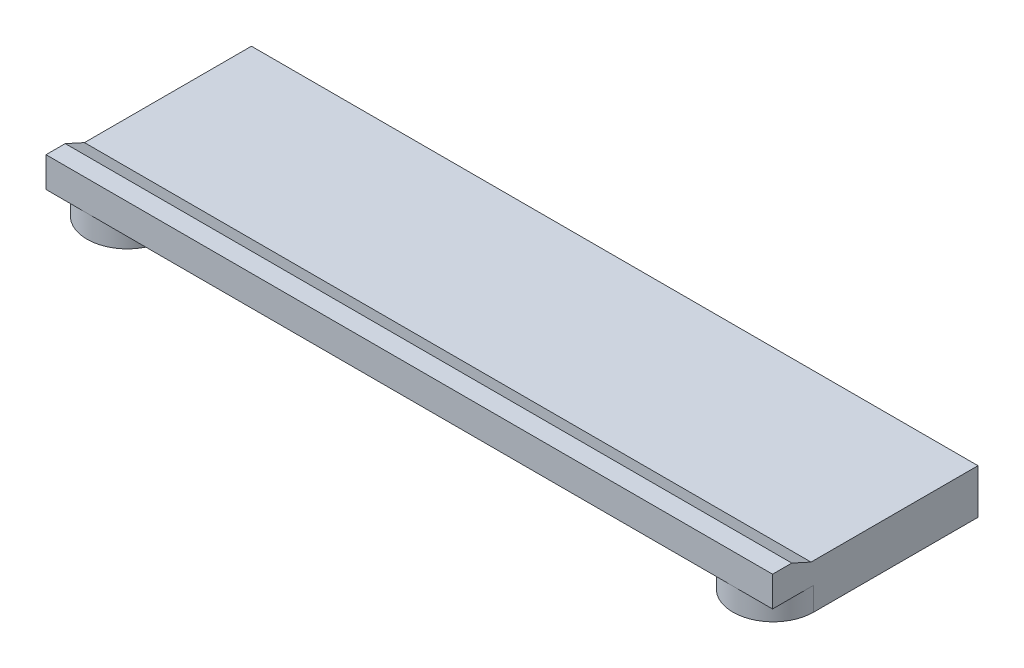
ISO-10303-21;
HEADER;
FILE_DESCRIPTION(('STEP AP214'),'2;1');
FILE_NAME('part.step','',(''),(''),'','','');
FILE_SCHEMA(('AUTOMOTIVE_DESIGN { 1 0 10303 214 1 1 1 1 }'));
ENDSEC;
DATA;
#1=APPLICATION_CONTEXT('core data for automotive mechanical design processes');
#2=APPLICATION_PROTOCOL_DEFINITION('international standard','automotive_design',2000,#1);
#3=PRODUCT_CONTEXT('',#1,'mechanical');
#4=PRODUCT('Part','Part','',(#3));
#5=PRODUCT_RELATED_PRODUCT_CATEGORY('part','',(#4));
#6=PRODUCT_DEFINITION_FORMATION('','',#4);
#7=PRODUCT_DEFINITION_CONTEXT('part definition',#1,'design');
#8=PRODUCT_DEFINITION('design','',#6,#7);
#9=PRODUCT_DEFINITION_SHAPE('','',#8);
#10=(LENGTH_UNIT() NAMED_UNIT(*) SI_UNIT(.MILLI.,.METRE.));
#11=(NAMED_UNIT(*) PLANE_ANGLE_UNIT() SI_UNIT($,.RADIAN.));
#12=(NAMED_UNIT(*) SI_UNIT($,.STERADIAN.) SOLID_ANGLE_UNIT());
#13=UNCERTAINTY_MEASURE_WITH_UNIT(LENGTH_MEASURE(1.E-05),#10,'distance_accuracy_value','');
#14=(GEOMETRIC_REPRESENTATION_CONTEXT(3) GLOBAL_UNCERTAINTY_ASSIGNED_CONTEXT((#13)) GLOBAL_UNIT_ASSIGNED_CONTEXT((#10,
#11,#12)) REPRESENTATION_CONTEXT('',''));
#15=CARTESIAN_POINT('',(0.,0.,0.));
#16=DIRECTION('',(0.,0.,1.));
#17=DIRECTION('',(1.,0.,0.));
#18=AXIS2_PLACEMENT_3D('',#15,#16,#17);
#19=CARTESIAN_POINT('',(0.,22.,0.));
#20=DIRECTION('',(0.,1.,0.));
#21=DIRECTION('',(0.,0.,1.));
#22=AXIS2_PLACEMENT_3D('',#19,#20,#21);
#23=PLANE('',#22);
#24=DIRECTION('',(0.,0.,1.));
#25=VECTOR('',#24,1.);
#26=CARTESIAN_POINT('',(-55.4957899853109,22.,0.));
#27=LINE('',#26,#25);
#28=CARTESIAN_POINT('',(-55.4957899853109,22.,0.));
#29=VERTEX_POINT('',#28);
#30=CARTESIAN_POINT('',(-55.4957899853109,22.,171.718950609947));
#31=VERTEX_POINT('',#30);
#32=EDGE_CURVE('E306',#29,#31,#27,.T.);
#33=ORIENTED_EDGE('',*,*,#32,.T.);
#34=DIRECTION('',(-1.,0.,0.));
#35=VECTOR('',#34,1.);
#36=CARTESIAN_POINT('',(691.714210014689,22.,171.718950609947));
#37=LINE('',#36,#35);
#38=CARTESIAN_POINT('',(691.714210014689,22.,171.718950609947));
#39=VERTEX_POINT('',#38);
#40=EDGE_CURVE('E200',#39,#31,#37,.T.);
#41=ORIENTED_EDGE('',*,*,#40,.F.);
#42=DIRECTION('',(0.,0.,-1.));
#43=VECTOR('',#42,1.);
#44=CARTESIAN_POINT('',(691.714210014689,22.,211.28));
#45=LINE('',#44,#43);
#46=CARTESIAN_POINT('',(691.714210014689,22.,0.));
#47=VERTEX_POINT('',#46);
#48=EDGE_CURVE('E313',#39,#47,#45,.T.);
#49=ORIENTED_EDGE('',*,*,#48,.T.);
#50=DIRECTION('',(-1.,0.,0.));
#51=VECTOR('',#50,1.);
#52=CARTESIAN_POINT('',(-55.4957899853109,22.,0.));
#53=LINE('',#52,#51);
#54=EDGE_CURVE('E309',#47,#29,#53,.T.);
#55=ORIENTED_EDGE('',*,*,#54,.T.);
#56=EDGE_LOOP('',(#33,#41,#49,#55));
#57=FACE_BOUND('',#56,.T.);
#58=ADVANCED_FACE('F43',(#57),#23,.T.);
#59=CARTESIAN_POINT('',(-55.4957899853109,22.,0.));
#60=DIRECTION('',(1.,0.,0.));
#61=DIRECTION('',(0.,0.,-1.));
#62=AXIS2_PLACEMENT_3D('',#59,#60,#61);
#63=PLANE('',#62);
#64=DIRECTION('',(0.,-1.,0.));
#65=VECTOR('',#64,1.);
#66=CARTESIAN_POINT('',(-55.4957899853109,14.9999999999999,169.06124837));
#67=LINE('',#66,#65);
#68=CARTESIAN_POINT('',(-55.4957899853109,0.,169.06124837));
#69=VERTEX_POINT('',#68);
#70=CARTESIAN_POINT('',(-55.4957899853109,-24.,169.06124837));
#71=VERTEX_POINT('',#70);
#72=EDGE_CURVE('E168',#69,#71,#67,.T.);
#73=ORIENTED_EDGE('',*,*,#72,.F.);
#74=DIRECTION('',(0.,0.,1.));
#75=VECTOR('',#74,1.);
#76=CARTESIAN_POINT('',(-55.4957899853109,0.,0.));
#77=LINE('',#76,#75);
#78=CARTESIAN_POINT('',(-55.4957899853109,0.,211.28));
#79=VERTEX_POINT('',#78);
#80=EDGE_CURVE('E281',#69,#79,#77,.T.);
#81=ORIENTED_EDGE('',*,*,#80,.T.);
#82=DIRECTION('',(0.,-1.,0.));
#83=VECTOR('',#82,1.);
#84=CARTESIAN_POINT('',(-55.4957899853109,22.,211.28));
#85=LINE('',#84,#83);
#86=CARTESIAN_POINT('',(-55.4957899853109,31.,211.28));
#87=VERTEX_POINT('',#86);
#88=EDGE_CURVE('E275',#87,#79,#85,.T.);
#89=ORIENTED_EDGE('',*,*,#88,.F.);
#90=DIRECTION('',(0.,0.,1.));
#91=VECTOR('',#90,1.);
#92=CARTESIAN_POINT('',(-55.4957899853109,31.,211.28));
#93=LINE('',#92,#91);
#94=CARTESIAN_POINT('',(-55.4957899853109,31.,191.499475304974));
#95=VERTEX_POINT('',#94);
#96=EDGE_CURVE('E254',#95,#87,#93,.T.);
#97=ORIENTED_EDGE('',*,*,#96,.F.);
#98=DIRECTION('',(0.,0.414140513415841,0.910212961425876));
#99=VECTOR('',#98,1.);
#100=CARTESIAN_POINT('',(-55.4957899853109,22.,171.718950609947));
#101=LINE('',#100,#99);
#102=EDGE_CURVE('E194',#31,#95,#101,.T.);
#103=ORIENTED_EDGE('',*,*,#102,.F.);
#104=ORIENTED_EDGE('',*,*,#32,.F.);
#105=DIRECTION('',(0.,-1.,0.));
#106=VECTOR('',#105,1.);
#107=CARTESIAN_POINT('',(-55.4957899853109,22.,0.));
#108=LINE('',#107,#106);
#109=CARTESIAN_POINT('',(-55.4957899853109,-24.,0.));
#110=VERTEX_POINT('',#109);
#111=EDGE_CURVE('E305',#29,#110,#108,.T.);
#112=ORIENTED_EDGE('',*,*,#111,.T.);
#113=DIRECTION('',(0.,0.,-1.));
#114=VECTOR('',#113,1.);
#115=CARTESIAN_POINT('',(-55.4957899853109,-24.,0.));
#116=LINE('',#115,#114);
#117=EDGE_CURVE('E148',#71,#110,#116,.T.);
#118=ORIENTED_EDGE('',*,*,#117,.F.);
#119=EDGE_LOOP('',(#73,#81,#89,#97,#103,#104,#112,#118));
#120=FACE_BOUND('',#119,.T.);
#121=ADVANCED_FACE('F45',(#120),#63,.F.);
#122=CARTESIAN_POINT('',(-55.4957899853109,22.,211.28));
#123=DIRECTION('',(0.,0.,-1.));
#124=DIRECTION('',(-1.,0.,0.));
#125=AXIS2_PLACEMENT_3D('',#122,#123,#124);
#126=PLANE('',#125);
#127=DIRECTION('',(1.,0.,0.));
#128=VECTOR('',#127,1.);
#129=CARTESIAN_POINT('',(-55.4957899853109,0.,211.28));
#130=LINE('',#129,#128);
#131=CARTESIAN_POINT('',(691.714210014689,0.,211.28));
#132=VERTEX_POINT('',#131);
#133=EDGE_CURVE('E283',#79,#132,#130,.T.);
#134=ORIENTED_EDGE('',*,*,#133,.T.);
#135=DIRECTION('',(0.,-1.,0.));
#136=VECTOR('',#135,1.);
#137=CARTESIAN_POINT('',(691.714210014689,22.,211.28));
#138=LINE('',#137,#136);
#139=CARTESIAN_POINT('',(691.714210014689,31.,211.28));
#140=VERTEX_POINT('',#139);
#141=EDGE_CURVE('E311',#140,#132,#138,.T.);
#142=ORIENTED_EDGE('',*,*,#141,.F.);
#143=DIRECTION('',(1.,0.,0.));
#144=VECTOR('',#143,1.);
#145=CARTESIAN_POINT('',(691.714210014689,31.,211.28));
#146=LINE('',#145,#144);
#147=EDGE_CURVE('E187',#87,#140,#146,.T.);
#148=ORIENTED_EDGE('',*,*,#147,.F.);
#149=ORIENTED_EDGE('',*,*,#88,.T.);
#150=EDGE_LOOP('',(#134,#142,#148,#149));
#151=FACE_BOUND('',#150,.T.);
#152=ADVANCED_FACE('F346',(#151),#126,.F.);
#153=CARTESIAN_POINT('',(691.714210014689,22.,211.28));
#154=DIRECTION('',(-1.,0.,0.));
#155=DIRECTION('',(0.,0.,1.));
#156=AXIS2_PLACEMENT_3D('',#153,#154,#155);
#157=PLANE('',#156);
#158=DIRECTION('',(0.,0.,-1.));
#159=VECTOR('',#158,1.);
#160=CARTESIAN_POINT('',(691.714210014689,0.,211.28));
#161=LINE('',#160,#159);
#162=CARTESIAN_POINT('',(691.714210014689,0.,169.061248365664));
#163=VERTEX_POINT('',#162);
#164=EDGE_CURVE('E327',#132,#163,#161,.T.);
#165=ORIENTED_EDGE('',*,*,#164,.T.);
#166=DIRECTION('',(0.,-1.,0.));
#167=VECTOR('',#166,1.);
#168=CARTESIAN_POINT('',(691.714210014689,14.9999999999999,169.061248365664));
#169=LINE('',#168,#167);
#170=CARTESIAN_POINT('',(691.714210014689,-24.,169.061248365664));
#171=VERTEX_POINT('',#170);
#172=EDGE_CURVE('E67',#163,#171,#169,.T.);
#173=ORIENTED_EDGE('',*,*,#172,.T.);
#174=DIRECTION('',(0.,0.,1.));
#175=VECTOR('',#174,1.);
#176=CARTESIAN_POINT('',(691.714210014689,-24.,169.061248365664));
#177=LINE('',#176,#175);
#178=CARTESIAN_POINT('',(691.714210014689,-24.,0.));
#179=VERTEX_POINT('',#178);
#180=EDGE_CURVE('E170',#179,#171,#177,.T.);
#181=ORIENTED_EDGE('',*,*,#180,.F.);
#182=DIRECTION('',(0.,-1.,0.));
#183=VECTOR('',#182,1.);
#184=CARTESIAN_POINT('',(691.714210014689,22.,0.));
#185=LINE('',#184,#183);
#186=EDGE_CURVE('E308',#47,#179,#185,.T.);
#187=ORIENTED_EDGE('',*,*,#186,.F.);
#188=ORIENTED_EDGE('',*,*,#48,.F.);
#189=DIRECTION('',(0.,0.414140513415841,0.910212961425876));
#190=VECTOR('',#189,1.);
#191=CARTESIAN_POINT('',(691.714210014689,22.,171.718950609947));
#192=LINE('',#191,#190);
#193=CARTESIAN_POINT('',(691.714210014689,31.,191.499475304974));
#194=VERTEX_POINT('',#193);
#195=EDGE_CURVE('E191',#39,#194,#192,.T.);
#196=ORIENTED_EDGE('',*,*,#195,.T.);
#197=DIRECTION('',(0.,0.,-1.));
#198=VECTOR('',#197,1.);
#199=CARTESIAN_POINT('',(691.714210014689,31.,191.499475304974));
#200=LINE('',#199,#198);
#201=EDGE_CURVE('E195',#140,#194,#200,.T.);
#202=ORIENTED_EDGE('',*,*,#201,.F.);
#203=ORIENTED_EDGE('',*,*,#141,.T.);
#204=EDGE_LOOP('',(#165,#173,#181,#187,#188,#196,#202,#203));
#205=FACE_BOUND('',#204,.T.);
#206=ADVANCED_FACE('F332',(#205),#157,.F.);
#207=CARTESIAN_POINT('',(-55.4957899853109,22.,0.));
#208=DIRECTION('',(0.,0.,1.));
#209=DIRECTION('',(1.,0.,0.));
#210=AXIS2_PLACEMENT_3D('',#207,#208,#209);
#211=PLANE('',#210);
#212=DIRECTION('',(-1.,0.,0.));
#213=VECTOR('',#212,1.);
#214=CARTESIAN_POINT('',(-55.4957899853109,0.,0.));
#215=LINE('',#214,#213);
#216=CARTESIAN_POINT('',(608.791185759771,0.,0.));
#217=VERTEX_POINT('',#216);
#218=CARTESIAN_POINT('',(27.4272342746891,0.,0.));
#219=VERTEX_POINT('',#218);
#220=EDGE_CURVE('E146',#217,#219,#215,.T.);
#221=ORIENTED_EDGE('',*,*,#220,.T.);
#222=DIRECTION('',(0.,-1.,0.));
#223=VECTOR('',#222,1.);
#224=CARTESIAN_POINT('',(27.4272342746891,14.9999999999999,0.));
#225=LINE('',#224,#223);
#226=CARTESIAN_POINT('',(27.4272342746891,-24.,0.));
#227=VERTEX_POINT('',#226);
#228=EDGE_CURVE('E59',#219,#227,#225,.T.);
#229=ORIENTED_EDGE('',*,*,#228,.T.);
#230=DIRECTION('',(1.,0.,0.));
#231=VECTOR('',#230,1.);
#232=CARTESIAN_POINT('',(-55.4957899853109,-24.,0.));
#233=LINE('',#232,#231);
#234=EDGE_CURVE('E142',#110,#227,#233,.T.);
#235=ORIENTED_EDGE('',*,*,#234,.F.);
#236=ORIENTED_EDGE('',*,*,#111,.F.);
#237=ORIENTED_EDGE('',*,*,#54,.F.);
#238=ORIENTED_EDGE('',*,*,#186,.T.);
#239=DIRECTION('',(1.,0.,0.));
#240=VECTOR('',#239,1.);
#241=CARTESIAN_POINT('',(691.714210014689,-24.,0.));
#242=LINE('',#241,#240);
#243=CARTESIAN_POINT('',(608.791185759771,-24.,0.));
#244=VERTEX_POINT('',#243);
#245=EDGE_CURVE('E182',#244,#179,#242,.T.);
#246=ORIENTED_EDGE('',*,*,#245,.F.);
#247=DIRECTION('',(0.,-1.,0.));
#248=VECTOR('',#247,1.);
#249=CARTESIAN_POINT('',(608.791185759771,14.9999999999999,0.));
#250=LINE('',#249,#248);
#251=EDGE_CURVE('E185',#217,#244,#250,.T.);
#252=ORIENTED_EDGE('',*,*,#251,.F.);
#253=EDGE_LOOP('',(#221,#229,#235,#236,#237,#238,#246,#252));
#254=FACE_BOUND('',#253,.T.);
#255=ADVANCED_FACE('F139',(#254),#211,.F.);
#256=CARTESIAN_POINT('',(0.,0.,0.));
#257=DIRECTION('',(0.,1.,0.));
#258=DIRECTION('',(0.,0.,1.));
#259=AXIS2_PLACEMENT_3D('',#256,#257,#258);
#260=PLANE('',#259);
#261=ORIENTED_EDGE('',*,*,#80,.F.);
#262=CARTESIAN_POINT('',(-14.0342778553109,0.,169.06124837));
#263=DIRECTION('',(0.,1.,0.));
#264=DIRECTION('',(0.,0.,1.));
#265=AXIS2_PLACEMENT_3D('',#262,#263,#264);
#266=CIRCLE('',#265,41.46151213);
#267=CARTESIAN_POINT('',(27.4272342746891,0.,169.06124837));
#268=VERTEX_POINT('',#267);
#269=EDGE_CURVE('E12',#69,#268,#266,.T.);
#270=ORIENTED_EDGE('',*,*,#269,.T.);
#271=DIRECTION('',(-0.796473833896179,0.,-0.604672995857035));
#272=VECTOR('',#271,1.);
#273=CARTESIAN_POINT('',(-71.3927445645277,0.,94.038353565113));
#274=LINE('',#273,#272);
#275=CARTESIAN_POINT('',(26.0753344871862,0.,168.034902921074));
#276=VERTEX_POINT('',#275);
#277=EDGE_CURVE('E52',#268,#276,#274,.T.);
#278=ORIENTED_EDGE('',*,*,#277,.T.);
#279=DIRECTION('',(0.00804509071307265,0.,-0.999967637734051));
#280=VECTOR('',#279,1.);
#281=CARTESIAN_POINT('',(27.4254590885144,0.,0.220647446866118));
#282=LINE('',#281,#280);
#283=EDGE_CURVE('E295',#276,#219,#282,.T.);
#284=ORIENTED_EDGE('',*,*,#283,.T.);
#285=ORIENTED_EDGE('',*,*,#220,.F.);
#286=DIRECTION('',(0.,0.,1.));
#287=VECTOR('',#286,1.);
#288=CARTESIAN_POINT('',(608.791185759771,0.,3.99792381845811E-13));
#289=LINE('',#288,#287);
#290=CARTESIAN_POINT('',(608.791185759771,0.,169.061248365664));
#291=VERTEX_POINT('',#290);
#292=EDGE_CURVE('E292',#217,#291,#289,.T.);
#293=ORIENTED_EDGE('',*,*,#292,.T.);
#294=CARTESIAN_POINT('',(650.25269788723,0.,169.061248365664));
#295=DIRECTION('',(0.,1.,0.));
#296=DIRECTION('',(0.,0.,1.));
#297=AXIS2_PLACEMENT_3D('',#294,#295,#296);
#298=CIRCLE('',#297,41.4615121274591);
#299=EDGE_CURVE('E290',#291,#163,#298,.T.);
#300=ORIENTED_EDGE('',*,*,#299,.T.);
#301=ORIENTED_EDGE('',*,*,#164,.F.);
#302=ORIENTED_EDGE('',*,*,#133,.F.);
#303=EDGE_LOOP('',(#261,#270,#278,#284,#285,#293,#300,#301,#302));
#304=FACE_BOUND('',#303,.T.);
#305=ADVANCED_FACE('F230',(#304),#260,.F.);
#306=CARTESIAN_POINT('',(0.,31.,0.));
#307=DIRECTION('',(0.,-1.,0.));
#308=DIRECTION('',(0.,0.,-1.));
#309=AXIS2_PLACEMENT_3D('',#306,#307,#308);
#310=PLANE('',#309);
#311=ORIENTED_EDGE('',*,*,#147,.T.);
#312=ORIENTED_EDGE('',*,*,#201,.T.);
#313=DIRECTION('',(-1.,0.,0.));
#314=VECTOR('',#313,1.);
#315=CARTESIAN_POINT('',(-55.4957899853109,31.,191.499475304974));
#316=LINE('',#315,#314);
#317=EDGE_CURVE('E206',#194,#95,#316,.T.);
#318=ORIENTED_EDGE('',*,*,#317,.T.);
#319=ORIENTED_EDGE('',*,*,#96,.T.);
#320=EDGE_LOOP('',(#311,#312,#318,#319));
#321=FACE_BOUND('',#320,.T.);
#322=ADVANCED_FACE('F224',(#321),#310,.F.);
#323=CARTESIAN_POINT('',(0.,-46.5037716191014,21.158889919495));
#324=DIRECTION('',(0.,-0.910212961425876,0.414140513415841));
#325=DIRECTION('',(0.,-0.414140513415841,-0.910212961425876));
#326=AXIS2_PLACEMENT_3D('',#323,#324,#325);
#327=PLANE('',#326);
#328=ORIENTED_EDGE('',*,*,#102,.T.);
#329=ORIENTED_EDGE('',*,*,#317,.F.);
#330=ORIENTED_EDGE('',*,*,#195,.F.);
#331=ORIENTED_EDGE('',*,*,#40,.T.);
#332=EDGE_LOOP('',(#328,#329,#330,#331));
#333=FACE_BOUND('',#332,.T.);
#334=ADVANCED_FACE('F213',(#333),#327,.F.);
#335=CARTESIAN_POINT('',(608.791185759771,14.9999999999999,0.));
#336=DIRECTION('',(-1.,0.,0.));
#337=DIRECTION('',(0.,0.,1.));
#338=AXIS2_PLACEMENT_3D('',#335,#336,#337);
#339=PLANE('',#338);
#340=ORIENTED_EDGE('',*,*,#292,.F.);
#341=ORIENTED_EDGE('',*,*,#251,.T.);
#342=DIRECTION('',(0.,0.,-1.));
#343=VECTOR('',#342,1.);
#344=CARTESIAN_POINT('',(608.791185759771,-24.,0.));
#345=LINE('',#344,#343);
#346=CARTESIAN_POINT('',(608.791185759771,-24.,169.061248365664));
#347=VERTEX_POINT('',#346);
#348=EDGE_CURVE('E179',#347,#244,#345,.T.);
#349=ORIENTED_EDGE('',*,*,#348,.F.);
#350=DIRECTION('',(0.,-1.,0.));
#351=VECTOR('',#350,1.);
#352=CARTESIAN_POINT('',(608.791185759771,14.9999999999999,169.061248365664));
#353=LINE('',#352,#351);
#354=EDGE_CURVE('E188',#291,#347,#353,.T.);
#355=ORIENTED_EDGE('',*,*,#354,.F.);
#356=EDGE_LOOP('',(#340,#341,#349,#355));
#357=FACE_BOUND('',#356,.T.);
#358=ADVANCED_FACE('F223',(#357),#339,.T.);
#359=CARTESIAN_POINT('',(650.25269788723,14.9999999999999,169.061248365664));
#360=DIRECTION('',(0.,-1.,0.));
#361=DIRECTION('',(0.,0.,-1.));
#362=AXIS2_PLACEMENT_3D('',#359,#360,#361);
#363=CYLINDRICAL_SURFACE('',#362,41.4615121274591);
#364=ORIENTED_EDGE('',*,*,#299,.F.);
#365=ORIENTED_EDGE('',*,*,#354,.T.);
#366=CARTESIAN_POINT('',(650.25269788723,-24.,169.061248365664));
#367=DIRECTION('',(0.,-1.,0.));
#368=DIRECTION('',(0.,0.,1.));
#369=AXIS2_PLACEMENT_3D('',#366,#367,#368);
#370=CIRCLE('',#369,41.4615121274591);
#371=EDGE_CURVE('E176',#171,#347,#370,.T.);
#372=ORIENTED_EDGE('',*,*,#371,.F.);
#373=ORIENTED_EDGE('',*,*,#172,.F.);
#374=EDGE_LOOP('',(#364,#365,#372,#373));
#375=FACE_BOUND('',#374,.T.);
#376=ADVANCED_FACE('F225',(#375),#363,.T.);
#377=CARTESIAN_POINT('',(650.25269788723,-24.,169.061248365664));
#378=DIRECTION('',(0.,1.,0.));
#379=DIRECTION('',(0.,0.,1.));
#380=AXIS2_PLACEMENT_3D('',#377,#378,#379);
#381=PLANE('',#380);
#382=ORIENTED_EDGE('',*,*,#180,.T.);
#383=ORIENTED_EDGE('',*,*,#371,.T.);
#384=ORIENTED_EDGE('',*,*,#348,.T.);
#385=ORIENTED_EDGE('',*,*,#245,.T.);
#386=EDGE_LOOP('',(#382,#383,#384,#385));
#387=FACE_BOUND('',#386,.T.);
#388=ADVANCED_FACE('F340',(#387),#381,.F.);
#389=CARTESIAN_POINT('',(-14.0342778553109,14.9999999999999,169.06124837));
#390=DIRECTION('',(0.,-1.,0.));
#391=DIRECTION('',(0.,0.,-1.));
#392=AXIS2_PLACEMENT_3D('',#389,#390,#391);
#393=CYLINDRICAL_SURFACE('',#392,41.46151213);
#394=ORIENTED_EDGE('',*,*,#269,.F.);
#395=ORIENTED_EDGE('',*,*,#72,.T.);
#396=CARTESIAN_POINT('',(-14.0342778553109,-24.,169.06124837));
#397=DIRECTION('',(0.,-1.,0.));
#398=DIRECTION('',(0.,0.,1.));
#399=AXIS2_PLACEMENT_3D('',#396,#397,#398);
#400=CIRCLE('',#399,41.46151213);
#401=CARTESIAN_POINT('',(27.4272342746891,-24.,169.06124837));
#402=VERTEX_POINT('',#401);
#403=EDGE_CURVE('E165',#402,#71,#400,.T.);
#404=ORIENTED_EDGE('',*,*,#403,.F.);
#405=DIRECTION('',(0.,-1.,0.));
#406=VECTOR('',#405,1.);
#407=CARTESIAN_POINT('',(27.4272342746891,14.9999999999999,169.06124837));
#408=LINE('',#407,#406);
#409=EDGE_CURVE('E171',#268,#402,#408,.T.);
#410=ORIENTED_EDGE('',*,*,#409,.F.);
#411=EDGE_LOOP('',(#394,#395,#404,#410));
#412=FACE_BOUND('',#411,.T.);
#413=ADVANCED_FACE('F304',(#412),#393,.T.);
#414=CARTESIAN_POINT('',(27.4272342746891,14.9999999999999,169.06124837));
#415=DIRECTION('',(0.604672995857035,0.,-0.796473833896179));
#416=DIRECTION('',(-0.796473833896179,0.,-0.604672995857035));
#417=AXIS2_PLACEMENT_3D('',#414,#415,#416);
#418=PLANE('',#417);
#419=ORIENTED_EDGE('',*,*,#277,.F.);
#420=ORIENTED_EDGE('',*,*,#409,.T.);
#421=DIRECTION('',(0.796473833896179,0.,0.604672995857035));
#422=VECTOR('',#421,1.);
#423=CARTESIAN_POINT('',(27.4272342746891,-24.,169.06124837));
#424=LINE('',#423,#422);
#425=CARTESIAN_POINT('',(26.0753344871862,-24.,168.034902921074));
#426=VERTEX_POINT('',#425);
#427=EDGE_CURVE('E157',#426,#402,#424,.T.);
#428=ORIENTED_EDGE('',*,*,#427,.F.);
#429=DIRECTION('',(0.,-1.,0.));
#430=VECTOR('',#429,1.);
#431=CARTESIAN_POINT('',(26.0753344871862,14.9999999999999,168.034902921074));
#432=LINE('',#431,#430);
#433=EDGE_CURVE('E147',#276,#426,#432,.T.);
#434=ORIENTED_EDGE('',*,*,#433,.F.);
#435=EDGE_LOOP('',(#419,#420,#428,#434));
#436=FACE_BOUND('',#435,.T.);
#437=ADVANCED_FACE('F301',(#436),#418,.T.);
#438=CARTESIAN_POINT('',(27.4272342746891,14.9999999999999,0.));
#439=DIRECTION('',(0.999967637734051,0.,0.00804509071307265));
#440=DIRECTION('',(0.00804509071307265,0.,-0.999967637734051));
#441=AXIS2_PLACEMENT_3D('',#438,#439,#440);
#442=PLANE('',#441);
#443=ORIENTED_EDGE('',*,*,#283,.F.);
#444=ORIENTED_EDGE('',*,*,#433,.T.);
#445=DIRECTION('',(-0.00804509071307265,0.,0.999967637734051));
#446=VECTOR('',#445,1.);
#447=CARTESIAN_POINT('',(27.4272342746891,-24.,0.));
#448=LINE('',#447,#446);
#449=EDGE_CURVE('E151',#227,#426,#448,.T.);
#450=ORIENTED_EDGE('',*,*,#449,.F.);
#451=ORIENTED_EDGE('',*,*,#228,.F.);
#452=EDGE_LOOP('',(#443,#444,#450,#451));
#453=FACE_BOUND('',#452,.T.);
#454=ADVANCED_FACE('F152',(#453),#442,.T.);
#455=CARTESIAN_POINT('',(-14.0342778553109,-24.,169.06124837));
#456=DIRECTION('',(0.,1.,0.));
#457=DIRECTION('',(0.,0.,1.));
#458=AXIS2_PLACEMENT_3D('',#455,#456,#457);
#459=PLANE('',#458);
#460=ORIENTED_EDGE('',*,*,#234,.T.);
#461=ORIENTED_EDGE('',*,*,#449,.T.);
#462=ORIENTED_EDGE('',*,*,#427,.T.);
#463=ORIENTED_EDGE('',*,*,#403,.T.);
#464=ORIENTED_EDGE('',*,*,#117,.T.);
#465=EDGE_LOOP('',(#460,#461,#462,#463,#464));
#466=FACE_BOUND('',#465,.T.);
#467=ADVANCED_FACE('F159',(#466),#459,.F.);
#468=CLOSED_SHELL('',(#58,#121,#152,#206,#255,#305,#322,#334,#358,#376,#388,#413,#437,#454,#467));
#469=MANIFOLD_SOLID_BREP('B2',#468);
#470=ADVANCED_BREP_SHAPE_REPRESENTATION('',(#18,#469),#14);
#471=SHAPE_DEFINITION_REPRESENTATION(#9,#470);
ENDSEC;
END-ISO-10303-21;
